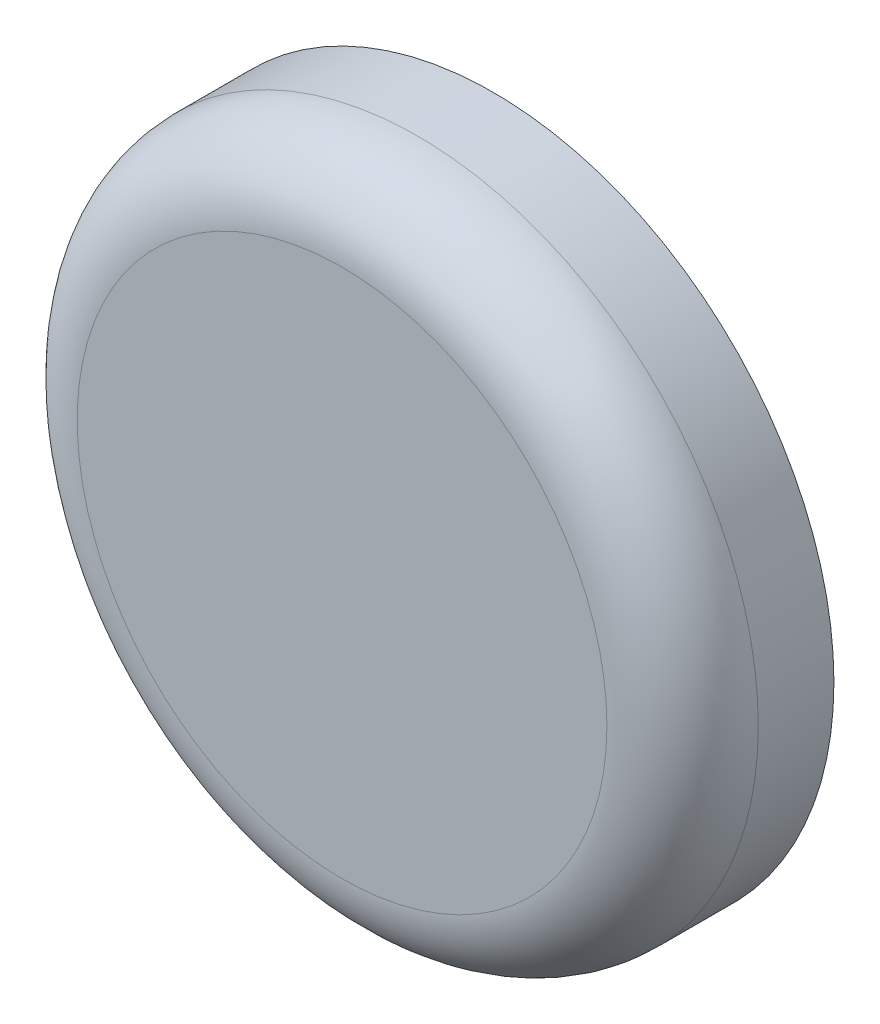
ISO-10303-21;
HEADER;
FILE_DESCRIPTION(('STEP AP214'),'2;1');
FILE_NAME('part.step','',(''),(''),'','','');
FILE_SCHEMA(('AUTOMOTIVE_DESIGN { 1 0 10303 214 1 1 1 1 }'));
ENDSEC;
DATA;
#1=APPLICATION_CONTEXT('core data for automotive mechanical design processes');
#2=APPLICATION_PROTOCOL_DEFINITION('international standard','automotive_design',2000,#1);
#3=PRODUCT_CONTEXT('',#1,'mechanical');
#4=PRODUCT('Part','Part','',(#3));
#5=PRODUCT_RELATED_PRODUCT_CATEGORY('part','',(#4));
#6=PRODUCT_DEFINITION_FORMATION('','',#4);
#7=PRODUCT_DEFINITION_CONTEXT('part definition',#1,'design');
#8=PRODUCT_DEFINITION('design','',#6,#7);
#9=PRODUCT_DEFINITION_SHAPE('','',#8);
#10=(LENGTH_UNIT() NAMED_UNIT(*) SI_UNIT(.MILLI.,.METRE.));
#11=(NAMED_UNIT(*) PLANE_ANGLE_UNIT() SI_UNIT($,.RADIAN.));
#12=(NAMED_UNIT(*) SI_UNIT($,.STERADIAN.) SOLID_ANGLE_UNIT());
#13=UNCERTAINTY_MEASURE_WITH_UNIT(LENGTH_MEASURE(1.E-05),#10,'distance_accuracy_value','');
#14=(GEOMETRIC_REPRESENTATION_CONTEXT(3) GLOBAL_UNCERTAINTY_ASSIGNED_CONTEXT((#13)) GLOBAL_UNIT_ASSIGNED_CONTEXT((#10,
#11,#12)) REPRESENTATION_CONTEXT('',''));
#15=CARTESIAN_POINT('',(0.,0.,0.));
#16=DIRECTION('',(0.,0.,1.));
#17=DIRECTION('',(1.,0.,0.));
#18=AXIS2_PLACEMENT_3D('',#15,#16,#17);
#19=CARTESIAN_POINT('',(0.,0.,2.));
#20=DIRECTION('',(0.,0.,-1.));
#21=DIRECTION('',(-1.,0.,0.));
#22=AXIS2_PLACEMENT_3D('',#19,#20,#21);
#23=CYLINDRICAL_SURFACE('',#22,4.5);
#24=CARTESIAN_POINT('',(0.,0.,1.));
#25=DIRECTION('',(0.,0.,1.));
#26=DIRECTION('',(1.,0.,0.));
#27=AXIS2_PLACEMENT_3D('',#24,#25,#26);
#28=CIRCLE('',#27,4.5);
#29=CARTESIAN_POINT('',(4.5,0.,1.));
#30=VERTEX_POINT('',#29);
#31=EDGE_CURVE('E10',#30,#30,#28,.F.);
#32=ORIENTED_EDGE('',*,*,#31,.T.);
#33=EDGE_LOOP('',(#32));
#34=FACE_BOUND('',#33,.T.);
#35=CARTESIAN_POINT('',(0.,0.,0.));
#36=DIRECTION('',(0.,0.,1.));
#37=DIRECTION('',(1.,0.,0.));
#38=AXIS2_PLACEMENT_3D('',#35,#36,#37);
#39=CIRCLE('',#38,4.5);
#40=CARTESIAN_POINT('',(4.5,0.,0.));
#41=VERTEX_POINT('',#40);
#42=EDGE_CURVE('E44',#41,#41,#39,.T.);
#43=ORIENTED_EDGE('',*,*,#42,.T.);
#44=EDGE_LOOP('',(#43));
#45=FACE_BOUND('',#44,.T.);
#46=ADVANCED_FACE('F33',(#34,#45),#23,.T.);
#47=CARTESIAN_POINT('',(0.,0.,2.));
#48=DIRECTION('',(0.,0.,1.));
#49=DIRECTION('',(1.,0.,0.));
#50=AXIS2_PLACEMENT_3D('',#47,#48,#49);
#51=PLANE('',#50);
#52=CARTESIAN_POINT('',(0.,0.,2.));
#53=DIRECTION('',(0.,0.,1.));
#54=DIRECTION('',(1.,0.,0.));
#55=AXIS2_PLACEMENT_3D('',#52,#53,#54);
#56=CIRCLE('',#55,3.5);
#57=CARTESIAN_POINT('',(3.5,0.,2.));
#58=VERTEX_POINT('',#57);
#59=EDGE_CURVE('E40',#58,#58,#56,.T.);
#60=ORIENTED_EDGE('',*,*,#59,.T.);
#61=EDGE_LOOP('',(#60));
#62=FACE_BOUND('',#61,.T.);
#63=ADVANCED_FACE('F54',(#62),#51,.T.);
#64=CARTESIAN_POINT('',(0.,0.,0.));
#65=DIRECTION('',(0.,0.,1.));
#66=DIRECTION('',(1.,0.,0.));
#67=AXIS2_PLACEMENT_3D('',#64,#65,#66);
#68=PLANE('',#67);
#69=ORIENTED_EDGE('',*,*,#42,.F.);
#70=EDGE_LOOP('',(#69));
#71=FACE_BOUND('',#70,.T.);
#72=ADVANCED_FACE('F52',(#71),#68,.F.);
#73=CARTESIAN_POINT('',(0.,0.,1.));
#74=DIRECTION('',(0.,0.,1.));
#75=DIRECTION('',(1.,0.,0.));
#76=AXIS2_PLACEMENT_3D('',#73,#74,#75);
#77=TOROIDAL_SURFACE('',#76,3.5,1.);
#78=ORIENTED_EDGE('',*,*,#31,.F.);
#79=EDGE_LOOP('',(#78));
#80=FACE_BOUND('',#79,.T.);
#81=ORIENTED_EDGE('',*,*,#59,.F.);
#82=EDGE_LOOP('',(#81));
#83=FACE_BOUND('',#82,.T.);
#84=ADVANCED_FACE('F35',(#80,#83),#77,.T.);
#85=CLOSED_SHELL('',(#46,#63,#72,#84));
#86=MANIFOLD_SOLID_BREP('B2',#85);
#87=ADVANCED_BREP_SHAPE_REPRESENTATION('',(#18,#86),#14);
#88=SHAPE_DEFINITION_REPRESENTATION(#9,#87);
ENDSEC;
END-ISO-10303-21;
